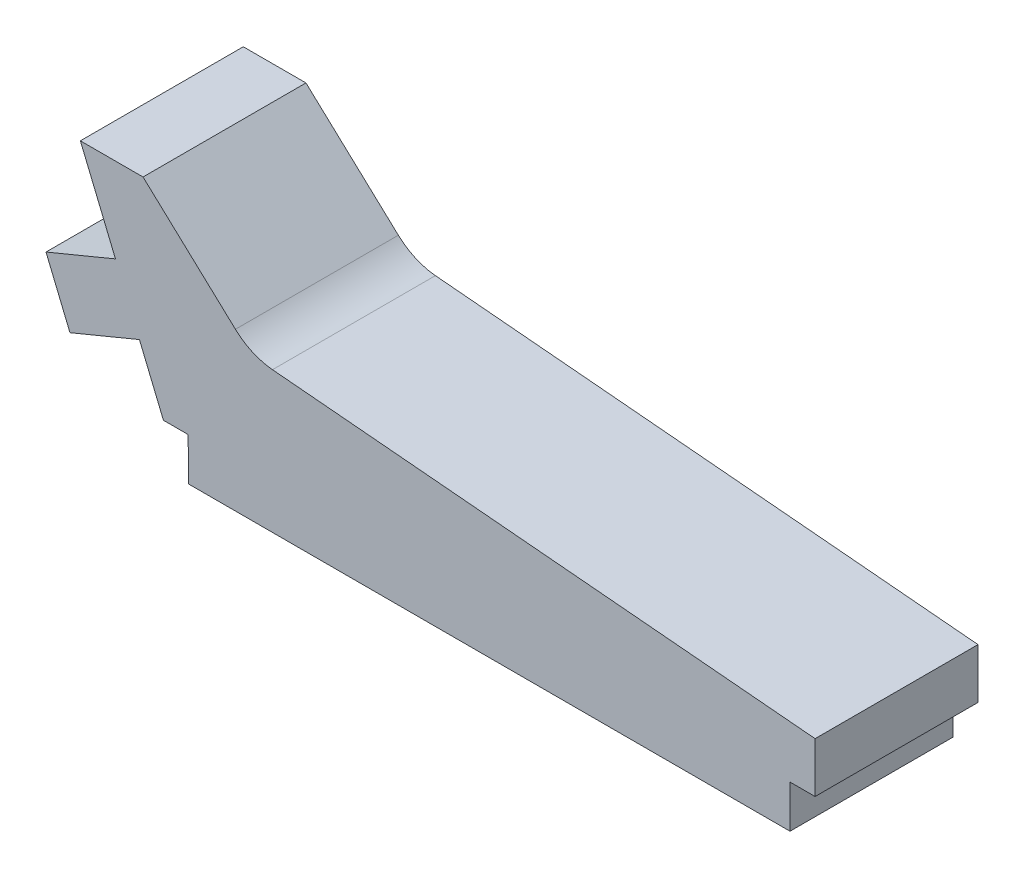
ISO-10303-21;
HEADER;
FILE_DESCRIPTION(('STEP AP214'),'2;1');
FILE_NAME('part.step','',(''),(''),'','','');
FILE_SCHEMA(('AUTOMOTIVE_DESIGN { 1 0 10303 214 1 1 1 1 }'));
ENDSEC;
DATA;
#1=APPLICATION_CONTEXT('core data for automotive mechanical design processes');
#2=APPLICATION_PROTOCOL_DEFINITION('international standard','automotive_design',2000,#1);
#3=PRODUCT_CONTEXT('',#1,'mechanical');
#4=PRODUCT('Part','Part','',(#3));
#5=PRODUCT_RELATED_PRODUCT_CATEGORY('part','',(#4));
#6=PRODUCT_DEFINITION_FORMATION('','',#4);
#7=PRODUCT_DEFINITION_CONTEXT('part definition',#1,'design');
#8=PRODUCT_DEFINITION('design','',#6,#7);
#9=PRODUCT_DEFINITION_SHAPE('','',#8);
#10=(LENGTH_UNIT() NAMED_UNIT(*) SI_UNIT(.MILLI.,.METRE.));
#11=(NAMED_UNIT(*) PLANE_ANGLE_UNIT() SI_UNIT($,.RADIAN.));
#12=(NAMED_UNIT(*) SI_UNIT($,.STERADIAN.) SOLID_ANGLE_UNIT());
#13=UNCERTAINTY_MEASURE_WITH_UNIT(LENGTH_MEASURE(1.E-05),#10,'distance_accuracy_value','');
#14=(GEOMETRIC_REPRESENTATION_CONTEXT(3) GLOBAL_UNCERTAINTY_ASSIGNED_CONTEXT((#13)) GLOBAL_UNIT_ASSIGNED_CONTEXT((#10,
#11,#12)) REPRESENTATION_CONTEXT('',''));
#15=CARTESIAN_POINT('',(0.,0.,0.));
#16=DIRECTION('',(0.,0.,1.));
#17=DIRECTION('',(1.,0.,0.));
#18=AXIS2_PLACEMENT_3D('',#15,#16,#17);
#19=CARTESIAN_POINT('',(103.055278353446,95.0327900963858,67.31));
#20=DIRECTION('',(0.,0.,-1.));
#21=DIRECTION('',(-1.,0.,0.));
#22=AXIS2_PLACEMENT_3D('',#19,#20,#21);
#23=CYLINDRICAL_SURFACE('',#22,6.35);
#24=CARTESIAN_POINT('',(103.055278353446,95.0327900963858,50.8));
#25=DIRECTION('',(0.,0.,1.));
#26=DIRECTION('',(1.,0.,0.));
#27=AXIS2_PLACEMENT_3D('',#24,#25,#26);
#28=CIRCLE('',#27,6.35);
#29=CARTESIAN_POINT('',(98.7376529803762,90.3765457795755,50.8));
#30=VERTEX_POINT('',#29);
#31=CARTESIAN_POINT('',(102.493050685143,88.7077288279872,50.8));
#32=VERTEX_POINT('',#31);
#33=EDGE_CURVE('E145',#30,#32,#28,.T.);
#34=ORIENTED_EDGE('',*,*,#33,.F.);
#35=DIRECTION('',(0.,0.,-1.));
#36=VECTOR('',#35,1.);
#37=CARTESIAN_POINT('',(98.7376529803762,90.3765457795755,67.31));
#38=LINE('',#37,#36);
#39=CARTESIAN_POINT('',(98.7376529803762,90.3765457795755,67.31));
#40=VERTEX_POINT('',#39);
#41=EDGE_CURVE('E11',#40,#30,#38,.T.);
#42=ORIENTED_EDGE('',*,*,#41,.F.);
#43=CARTESIAN_POINT('',(103.055278353446,95.0327900963858,67.31));
#44=DIRECTION('',(0.,0.,1.));
#45=DIRECTION('',(1.,0.,0.));
#46=AXIS2_PLACEMENT_3D('',#43,#44,#45);
#47=CIRCLE('',#46,6.35);
#48=CARTESIAN_POINT('',(102.493050685143,88.7077288279872,67.31));
#49=VERTEX_POINT('',#48);
#50=EDGE_CURVE('E149',#40,#49,#47,.T.);
#51=ORIENTED_EDGE('',*,*,#50,.T.);
#52=DIRECTION('',(0.,0.,-1.));
#53=VECTOR('',#52,1.);
#54=CARTESIAN_POINT('',(102.493050685143,88.7077288279872,67.31));
#55=LINE('',#54,#53);
#56=EDGE_CURVE('E162',#49,#32,#55,.T.);
#57=ORIENTED_EDGE('',*,*,#56,.T.);
#58=EDGE_LOOP('',(#34,#42,#51,#57));
#59=FACE_BOUND('',#58,.T.);
#60=ADVANCED_FACE('F37',(#59),#23,.F.);
#61=CARTESIAN_POINT('',(208.181982596549,-11.1085959651032,67.31));
#62=DIRECTION('',(-0.679941003632963,-0.733266821544927,0.));
#63=DIRECTION('',(0.733266821544927,-0.679941003632963,0.));
#64=AXIS2_PLACEMENT_3D('',#61,#62,#63);
#65=PLANE('',#64);
#66=DIRECTION('',(-0.733266821544927,0.679941003632962,0.));
#67=VECTOR('',#66,1.);
#68=CARTESIAN_POINT('',(208.181982596549,-11.1085959651032,50.8));
#69=LINE('',#68,#67);
#70=CARTESIAN_POINT('',(89.3731804125787,99.06,50.8));
#71=VERTEX_POINT('',#70);
#72=EDGE_CURVE('E210',#30,#71,#69,.T.);
#73=ORIENTED_EDGE('',*,*,#72,.T.);
#74=DIRECTION('',(0.,0.,-1.));
#75=VECTOR('',#74,1.);
#76=CARTESIAN_POINT('',(89.3731804125787,99.06,67.31));
#77=LINE('',#76,#75);
#78=CARTESIAN_POINT('',(89.3731804125787,99.06,67.31));
#79=VERTEX_POINT('',#78);
#80=EDGE_CURVE('E45',#79,#71,#77,.T.);
#81=ORIENTED_EDGE('',*,*,#80,.F.);
#82=DIRECTION('',(-0.733266821544927,0.679941003632962,0.));
#83=VECTOR('',#82,1.);
#84=CARTESIAN_POINT('',(208.181982596549,-11.1085959651032,67.31));
#85=LINE('',#84,#83);
#86=EDGE_CURVE('E209',#40,#79,#85,.T.);
#87=ORIENTED_EDGE('',*,*,#86,.F.);
#88=ORIENTED_EDGE('',*,*,#41,.T.);
#89=EDGE_LOOP('',(#73,#81,#87,#88));
#90=FACE_BOUND('',#89,.T.);
#91=ADVANCED_FACE('F208',(#90),#65,.F.);
#92=CARTESIAN_POINT('',(101.6,99.06,67.31));
#93=DIRECTION('',(0.,-1.,0.));
#94=DIRECTION('',(0.,0.,-1.));
#95=AXIS2_PLACEMENT_3D('',#92,#93,#94);
#96=PLANE('',#95);
#97=DIRECTION('',(-1.,0.,0.));
#98=VECTOR('',#97,1.);
#99=CARTESIAN_POINT('',(101.6,99.06,50.8));
#100=LINE('',#99,#98);
#101=CARTESIAN_POINT('',(83.0231804125787,99.06,50.8));
#102=VERTEX_POINT('',#101);
#103=EDGE_CURVE('E203',#71,#102,#100,.T.);
#104=ORIENTED_EDGE('',*,*,#103,.T.);
#105=DIRECTION('',(0.,0.,-1.));
#106=VECTOR('',#105,1.);
#107=CARTESIAN_POINT('',(83.0231804125787,99.06,67.31));
#108=LINE('',#107,#106);
#109=CARTESIAN_POINT('',(83.0231804125787,99.06,67.31));
#110=VERTEX_POINT('',#109);
#111=EDGE_CURVE('E194',#110,#102,#108,.T.);
#112=ORIENTED_EDGE('',*,*,#111,.F.);
#113=DIRECTION('',(-1.,0.,0.));
#114=VECTOR('',#113,1.);
#115=CARTESIAN_POINT('',(101.6,99.06,67.31));
#116=LINE('',#115,#114);
#117=EDGE_CURVE('E204',#79,#110,#116,.T.);
#118=ORIENTED_EDGE('',*,*,#117,.F.);
#119=ORIENTED_EDGE('',*,*,#80,.T.);
#120=EDGE_LOOP('',(#104,#112,#118,#119));
#121=FACE_BOUND('',#120,.T.);
#122=ADVANCED_FACE('F201',(#121),#96,.F.);
#123=CARTESIAN_POINT('',(165.331918576091,-99.6508719761727,67.31));
#124=DIRECTION('',(0.923879532511291,0.382683432365079,0.));
#125=DIRECTION('',(-0.382683432365079,0.923879532511291,0.));
#126=AXIS2_PLACEMENT_3D('',#123,#124,#125);
#127=PLANE('',#126);
#128=DIRECTION('',(0.382683432365079,-0.923879532511291,0.));
#129=VECTOR('',#128,1.);
#130=CARTESIAN_POINT('',(165.331918576091,-99.6508719761727,50.8));
#131=LINE('',#130,#129);
#132=CARTESIAN_POINT('',(86.5799204089633,90.4732700628934,50.8));
#133=VERTEX_POINT('',#132);
#134=EDGE_CURVE('E212',#102,#133,#131,.T.);
#135=ORIENTED_EDGE('',*,*,#134,.T.);
#136=DIRECTION('',(0.,0.,-1.));
#137=VECTOR('',#136,1.);
#138=CARTESIAN_POINT('',(86.5799204089633,90.4732700628933,67.31));
#139=LINE('',#138,#137);
#140=CARTESIAN_POINT('',(86.5799204089633,90.4732700628933,67.31));
#141=VERTEX_POINT('',#140);
#142=EDGE_CURVE('E191',#141,#133,#139,.T.);
#143=ORIENTED_EDGE('',*,*,#142,.F.);
#144=DIRECTION('',(0.382683432365079,-0.923879532511291,0.));
#145=VECTOR('',#144,1.);
#146=CARTESIAN_POINT('',(165.331918576091,-99.6508719761727,67.31));
#147=LINE('',#146,#145);
#148=EDGE_CURVE('E290',#110,#141,#147,.T.);
#149=ORIENTED_EDGE('',*,*,#148,.F.);
#150=ORIENTED_EDGE('',*,*,#111,.T.);
#151=EDGE_LOOP('',(#135,#143,#149,#150));
#152=FACE_BOUND('',#151,.T.);
#153=ADVANCED_FACE('F288',(#152),#127,.F.);
#154=CARTESIAN_POINT('',(22.8480018328672,64.074645032615,67.31));
#155=DIRECTION('',(0.38268343236511,-0.923879532511278,0.));
#156=DIRECTION('',(0.923879532511279,0.38268343236511,0.));
#157=AXIS2_PLACEMENT_3D('',#154,#155,#156);
#158=PLANE('',#157);
#159=DIRECTION('',(-0.923879532511278,-0.38268343236511,0.));
#160=VECTOR('',#159,1.);
#161=CARTESIAN_POINT('',(22.8480018328672,64.074645032615,50.8));
#162=LINE('',#161,#160);
#163=CARTESIAN_POINT('',(79.5399583712273,87.5572223082712,50.8));
#164=VERTEX_POINT('',#163);
#165=EDGE_CURVE('E219',#133,#164,#162,.T.);
#166=ORIENTED_EDGE('',*,*,#165,.T.);
#167=DIRECTION('',(0.,0.,-1.));
#168=VECTOR('',#167,1.);
#169=CARTESIAN_POINT('',(79.5399583712273,87.5572223082712,67.31));
#170=LINE('',#169,#168);
#171=CARTESIAN_POINT('',(79.5399583712273,87.5572223082712,67.31));
#172=VERTEX_POINT('',#171);
#173=EDGE_CURVE('E188',#172,#164,#170,.T.);
#174=ORIENTED_EDGE('',*,*,#173,.F.);
#175=DIRECTION('',(-0.923879532511278,-0.38268343236511,0.));
#176=VECTOR('',#175,1.);
#177=CARTESIAN_POINT('',(22.8480018328672,64.074645032615,67.31));
#178=LINE('',#177,#176);
#179=EDGE_CURVE('E285',#141,#172,#178,.T.);
#180=ORIENTED_EDGE('',*,*,#179,.F.);
#181=ORIENTED_EDGE('',*,*,#142,.T.);
#182=EDGE_LOOP('',(#166,#174,#180,#181));
#183=FACE_BOUND('',#182,.T.);
#184=ADVANCED_FACE('F284',(#183),#158,.F.);
#185=CARTESIAN_POINT('',(158.291956538356,-102.566919730793,67.31));
#186=DIRECTION('',(0.923879532511287,0.382683432365089,0.));
#187=DIRECTION('',(-0.382683432365089,0.923879532511287,0.));
#188=AXIS2_PLACEMENT_3D('',#185,#186,#187);
#189=PLANE('',#188);
#190=DIRECTION('',(0.382683432365089,-0.923879532511287,0.));
#191=VECTOR('',#190,1.);
#192=CARTESIAN_POINT('',(158.291956538356,-102.566919730793,50.8));
#193=LINE('',#192,#191);
#194=CARTESIAN_POINT('',(81.9699981667456,81.6905872768247,50.8));
#195=VERTEX_POINT('',#194);
#196=EDGE_CURVE('E222',#164,#195,#193,.T.);
#197=ORIENTED_EDGE('',*,*,#196,.T.);
#198=DIRECTION('',(0.,0.,-1.));
#199=VECTOR('',#198,1.);
#200=CARTESIAN_POINT('',(81.9699981667456,81.6905872768247,67.31));
#201=LINE('',#200,#199);
#202=CARTESIAN_POINT('',(81.9699981667456,81.6905872768247,67.31));
#203=VERTEX_POINT('',#202);
#204=EDGE_CURVE('E185',#203,#195,#201,.T.);
#205=ORIENTED_EDGE('',*,*,#204,.F.);
#206=DIRECTION('',(0.382683432365089,-0.923879532511287,0.));
#207=VECTOR('',#206,1.);
#208=CARTESIAN_POINT('',(158.291956538356,-102.566919730793,67.31));
#209=LINE('',#208,#207);
#210=EDGE_CURVE('E281',#172,#203,#209,.T.);
#211=ORIENTED_EDGE('',*,*,#210,.F.);
#212=ORIENTED_EDGE('',*,*,#173,.T.);
#213=EDGE_LOOP('',(#197,#205,#211,#212));
#214=FACE_BOUND('',#213,.T.);
#215=ADVANCED_FACE('F278',(#214),#189,.F.);
#216=CARTESIAN_POINT('',(25.2780416283896,58.2080100011718,67.31));
#217=DIRECTION('',(-0.382683432365087,0.923879532511288,0.));
#218=DIRECTION('',(-0.923879532511288,-0.382683432365087,0.));
#219=AXIS2_PLACEMENT_3D('',#216,#217,#218);
#220=PLANE('',#219);
#221=DIRECTION('',(0.923879532511288,0.382683432365087,0.));
#222=VECTOR('',#221,1.);
#223=CARTESIAN_POINT('',(25.2780416283896,58.2080100011718,50.8));
#224=LINE('',#223,#222);
#225=CARTESIAN_POINT('',(89.0099602044816,84.6066350314467,50.8));
#226=VERTEX_POINT('',#225);
#227=EDGE_CURVE('E225',#195,#226,#224,.T.);
#228=ORIENTED_EDGE('',*,*,#227,.T.);
#229=DIRECTION('',(0.,0.,-1.));
#230=VECTOR('',#229,1.);
#231=CARTESIAN_POINT('',(89.0099602044816,84.6066350314467,67.31));
#232=LINE('',#231,#230);
#233=CARTESIAN_POINT('',(89.0099602044816,84.6066350314467,67.31));
#234=VERTEX_POINT('',#233);
#235=EDGE_CURVE('E182',#234,#226,#232,.T.);
#236=ORIENTED_EDGE('',*,*,#235,.F.);
#237=DIRECTION('',(0.923879532511288,0.382683432365087,0.));
#238=VECTOR('',#237,1.);
#239=CARTESIAN_POINT('',(25.2780416283896,58.2080100011718,67.31));
#240=LINE('',#239,#238);
#241=EDGE_CURVE('E275',#203,#234,#240,.T.);
#242=ORIENTED_EDGE('',*,*,#241,.F.);
#243=ORIENTED_EDGE('',*,*,#204,.T.);
#244=EDGE_LOOP('',(#228,#236,#242,#243));
#245=FACE_BOUND('',#244,.T.);
#246=ADVANCED_FACE('F274',(#245),#220,.F.);
#247=CARTESIAN_POINT('',(165.331918576093,-99.6508719761702,67.31));
#248=DIRECTION('',(0.923879532511284,0.382683432365095,0.));
#249=DIRECTION('',(-0.382683432365095,0.923879532511284,0.));
#250=AXIS2_PLACEMENT_3D('',#247,#248,#249);
#251=PLANE('',#250);
#252=DIRECTION('',(0.382683432365095,-0.923879532511285,0.));
#253=VECTOR('',#252,1.);
#254=CARTESIAN_POINT('',(165.331918576093,-99.6508719761702,50.8));
#255=LINE('',#254,#253);
#256=CARTESIAN_POINT('',(91.44,78.74,50.8));
#257=VERTEX_POINT('',#256);
#258=EDGE_CURVE('E228',#226,#257,#255,.T.);
#259=ORIENTED_EDGE('',*,*,#258,.T.);
#260=DIRECTION('',(0.,0.,-1.));
#261=VECTOR('',#260,1.);
#262=CARTESIAN_POINT('',(91.44,78.74,67.31));
#263=LINE('',#262,#261);
#264=CARTESIAN_POINT('',(91.44,78.74,67.31));
#265=VERTEX_POINT('',#264);
#266=EDGE_CURVE('E179',#265,#257,#263,.T.);
#267=ORIENTED_EDGE('',*,*,#266,.F.);
#268=DIRECTION('',(0.382683432365095,-0.923879532511285,0.));
#269=VECTOR('',#268,1.);
#270=CARTESIAN_POINT('',(165.331918576093,-99.6508719761702,67.31));
#271=LINE('',#270,#269);
#272=EDGE_CURVE('E271',#234,#265,#271,.T.);
#273=ORIENTED_EDGE('',*,*,#272,.F.);
#274=ORIENTED_EDGE('',*,*,#235,.T.);
#275=EDGE_LOOP('',(#259,#267,#273,#274));
#276=FACE_BOUND('',#275,.T.);
#277=ADVANCED_FACE('F268',(#276),#251,.F.);
#278=CARTESIAN_POINT('',(101.6,78.74,67.31));
#279=DIRECTION('',(0.,1.,0.));
#280=DIRECTION('',(0.,0.,1.));
#281=AXIS2_PLACEMENT_3D('',#278,#279,#280);
#282=PLANE('',#281);
#283=DIRECTION('',(1.,0.,0.));
#284=VECTOR('',#283,1.);
#285=CARTESIAN_POINT('',(101.6,78.74,50.8));
#286=LINE('',#285,#284);
#287=CARTESIAN_POINT('',(93.9474229626747,78.74,50.8));
#288=VERTEX_POINT('',#287);
#289=EDGE_CURVE('E231',#257,#288,#286,.T.);
#290=ORIENTED_EDGE('',*,*,#289,.T.);
#291=DIRECTION('',(0.,0.,-1.));
#292=VECTOR('',#291,1.);
#293=CARTESIAN_POINT('',(93.9474229626747,78.74,67.31));
#294=LINE('',#293,#292);
#295=CARTESIAN_POINT('',(93.9474229626747,78.74,67.31));
#296=VERTEX_POINT('',#295);
#297=EDGE_CURVE('E176',#296,#288,#294,.T.);
#298=ORIENTED_EDGE('',*,*,#297,.F.);
#299=DIRECTION('',(1.,0.,0.));
#300=VECTOR('',#299,1.);
#301=CARTESIAN_POINT('',(101.6,78.74,67.31));
#302=LINE('',#301,#300);
#303=EDGE_CURVE('E265',#265,#296,#302,.T.);
#304=ORIENTED_EDGE('',*,*,#303,.F.);
#305=ORIENTED_EDGE('',*,*,#266,.T.);
#306=EDGE_LOOP('',(#290,#298,#304,#305));
#307=FACE_BOUND('',#306,.T.);
#308=ADVANCED_FACE('F264',(#307),#282,.F.);
#309=CARTESIAN_POINT('',(95.492799547849,-126.095572619481,67.31));
#310=DIRECTION('',(0.99997154167335,0.00754425897113801,0.));
#311=DIRECTION('',(-0.00754425897113801,0.99997154167335,0.));
#312=AXIS2_PLACEMENT_3D('',#309,#310,#311);
#313=PLANE('',#312);
#314=DIRECTION('',(0.00754425897113801,-0.99997154167335,0.));
#315=VECTOR('',#314,1.);
#316=CARTESIAN_POINT('',(95.492799547849,-126.095572619481,50.8));
#317=LINE('',#316,#315);
#318=CARTESIAN_POINT('',(93.98,74.422,50.8));
#319=VERTEX_POINT('',#318);
#320=EDGE_CURVE('E234',#288,#319,#317,.T.);
#321=ORIENTED_EDGE('',*,*,#320,.T.);
#322=DIRECTION('',(0.,0.,-1.));
#323=VECTOR('',#322,1.);
#324=CARTESIAN_POINT('',(93.98,74.422,67.31));
#325=LINE('',#324,#323);
#326=CARTESIAN_POINT('',(93.98,74.422,67.31));
#327=VERTEX_POINT('',#326);
#328=EDGE_CURVE('E173',#327,#319,#325,.T.);
#329=ORIENTED_EDGE('',*,*,#328,.F.);
#330=DIRECTION('',(0.00754425897113801,-0.99997154167335,0.));
#331=VECTOR('',#330,1.);
#332=CARTESIAN_POINT('',(95.492799547849,-126.095572619481,67.31));
#333=LINE('',#332,#331);
#334=EDGE_CURVE('E261',#296,#327,#333,.T.);
#335=ORIENTED_EDGE('',*,*,#334,.F.);
#336=ORIENTED_EDGE('',*,*,#297,.T.);
#337=EDGE_LOOP('',(#321,#329,#335,#336));
#338=FACE_BOUND('',#337,.T.);
#339=ADVANCED_FACE('F258',(#338),#313,.F.);
#340=CARTESIAN_POINT('',(101.6,74.422,67.31));
#341=DIRECTION('',(0.,1.,0.));
#342=DIRECTION('',(0.,0.,1.));
#343=AXIS2_PLACEMENT_3D('',#340,#341,#342);
#344=PLANE('',#343);
#345=DIRECTION('',(1.,0.,0.));
#346=VECTOR('',#345,1.);
#347=CARTESIAN_POINT('',(101.6,74.422,50.8));
#348=LINE('',#347,#346);
#349=CARTESIAN_POINT('',(154.94,74.422,50.8));
#350=VERTEX_POINT('',#349);
#351=EDGE_CURVE('E237',#319,#350,#348,.T.);
#352=ORIENTED_EDGE('',*,*,#351,.T.);
#353=DIRECTION('',(0.,0.,-1.));
#354=VECTOR('',#353,1.);
#355=CARTESIAN_POINT('',(154.94,74.422,67.31));
#356=LINE('',#355,#354);
#357=CARTESIAN_POINT('',(154.94,74.422,67.31));
#358=VERTEX_POINT('',#357);
#359=EDGE_CURVE('E170',#358,#350,#356,.T.);
#360=ORIENTED_EDGE('',*,*,#359,.F.);
#361=DIRECTION('',(1.,0.,0.));
#362=VECTOR('',#361,1.);
#363=CARTESIAN_POINT('',(101.6,74.422,67.31));
#364=LINE('',#363,#362);
#365=EDGE_CURVE('E255',#327,#358,#364,.T.);
#366=ORIENTED_EDGE('',*,*,#365,.F.);
#367=ORIENTED_EDGE('',*,*,#328,.T.);
#368=EDGE_LOOP('',(#352,#360,#366,#367));
#369=FACE_BOUND('',#368,.T.);
#370=ADVANCED_FACE('F254',(#369),#344,.F.);
#371=CARTESIAN_POINT('',(154.94,-126.049497006446,67.31));
#372=DIRECTION('',(-1.,0.,0.));
#373=DIRECTION('',(0.,0.,1.));
#374=AXIS2_PLACEMENT_3D('',#371,#372,#373);
#375=PLANE('',#374);
#376=DIRECTION('',(0.,1.,0.));
#377=VECTOR('',#376,1.);
#378=CARTESIAN_POINT('',(154.94,-126.049497006446,50.8));
#379=LINE('',#378,#377);
#380=CARTESIAN_POINT('',(154.94,78.74,50.8));
#381=VERTEX_POINT('',#380);
#382=EDGE_CURVE('E240',#350,#381,#379,.T.);
#383=ORIENTED_EDGE('',*,*,#382,.T.);
#384=DIRECTION('',(0.,0.,-1.));
#385=VECTOR('',#384,1.);
#386=CARTESIAN_POINT('',(154.94,78.74,67.31));
#387=LINE('',#386,#385);
#388=CARTESIAN_POINT('',(154.94,78.74,67.31));
#389=VERTEX_POINT('',#388);
#390=EDGE_CURVE('E164',#389,#381,#387,.T.);
#391=ORIENTED_EDGE('',*,*,#390,.F.);
#392=DIRECTION('',(0.,1.,0.));
#393=VECTOR('',#392,1.);
#394=CARTESIAN_POINT('',(154.94,-126.049497006446,67.31));
#395=LINE('',#394,#393);
#396=EDGE_CURVE('E251',#358,#389,#395,.T.);
#397=ORIENTED_EDGE('',*,*,#396,.F.);
#398=ORIENTED_EDGE('',*,*,#359,.T.);
#399=EDGE_LOOP('',(#383,#391,#397,#398));
#400=FACE_BOUND('',#399,.T.);
#401=ADVANCED_FACE('F248',(#400),#375,.F.);
#402=CARTESIAN_POINT('',(101.599999999999,78.7399999999997,67.31));
#403=DIRECTION('',(0.,1.,0.));
#404=DIRECTION('',(-1.,0.,0.));
#405=AXIS2_PLACEMENT_3D('',#402,#403,#404);
#406=PLANE('',#405);
#407=DIRECTION('',(1.,0.,0.));
#408=VECTOR('',#407,1.);
#409=CARTESIAN_POINT('',(101.599999999999,78.7399999999997,50.8));
#410=LINE('',#409,#408);
#411=CARTESIAN_POINT('',(157.48,78.74,50.8));
#412=VERTEX_POINT('',#411);
#413=EDGE_CURVE('E159',#381,#412,#410,.T.);
#414=ORIENTED_EDGE('',*,*,#413,.T.);
#415=DIRECTION('',(0.,0.,-1.));
#416=VECTOR('',#415,1.);
#417=CARTESIAN_POINT('',(157.48,78.74,67.31));
#418=LINE('',#417,#416);
#419=CARTESIAN_POINT('',(157.48,78.74,67.31));
#420=VERTEX_POINT('',#419);
#421=EDGE_CURVE('E158',#420,#412,#418,.T.);
#422=ORIENTED_EDGE('',*,*,#421,.F.);
#423=DIRECTION('',(1.,0.,0.));
#424=VECTOR('',#423,1.);
#425=CARTESIAN_POINT('',(101.599999999999,78.7399999999997,67.31));
#426=LINE('',#425,#424);
#427=EDGE_CURVE('E303',#389,#420,#426,.T.);
#428=ORIENTED_EDGE('',*,*,#427,.F.);
#429=ORIENTED_EDGE('',*,*,#390,.T.);
#430=EDGE_LOOP('',(#414,#422,#428,#429));
#431=FACE_BOUND('',#430,.T.);
#432=ADVANCED_FACE('F244',(#431),#406,.F.);
#433=CARTESIAN_POINT('',(157.48,-126.049497006446,67.31));
#434=DIRECTION('',(-1.,0.,0.));
#435=DIRECTION('',(0.,0.,1.));
#436=AXIS2_PLACEMENT_3D('',#433,#434,#435);
#437=PLANE('',#436);
#438=DIRECTION('',(0.,1.,0.));
#439=VECTOR('',#438,1.);
#440=CARTESIAN_POINT('',(157.48,-126.049497006446,50.8));
#441=LINE('',#440,#439);
#442=CARTESIAN_POINT('',(157.48,83.82,50.8));
#443=VERTEX_POINT('',#442);
#444=EDGE_CURVE('E142',#412,#443,#441,.T.);
#445=ORIENTED_EDGE('',*,*,#444,.T.);
#446=DIRECTION('',(0.,0.,-1.));
#447=VECTOR('',#446,1.);
#448=CARTESIAN_POINT('',(157.48,83.82,67.31));
#449=LINE('',#448,#447);
#450=CARTESIAN_POINT('',(157.48,83.82,67.31));
#451=VERTEX_POINT('',#450);
#452=EDGE_CURVE('E156',#451,#443,#449,.T.);
#453=ORIENTED_EDGE('',*,*,#452,.F.);
#454=DIRECTION('',(0.,1.,0.));
#455=VECTOR('',#454,1.);
#456=CARTESIAN_POINT('',(157.48,-126.049497006446,67.31));
#457=LINE('',#456,#455);
#458=EDGE_CURVE('E305',#420,#451,#457,.T.);
#459=ORIENTED_EDGE('',*,*,#458,.F.);
#460=ORIENTED_EDGE('',*,*,#421,.T.);
#461=EDGE_LOOP('',(#445,#453,#459,#460));
#462=FACE_BOUND('',#461,.T.);
#463=ADVANCED_FACE('F154',(#462),#437,.F.);
#464=CARTESIAN_POINT('',(120.546883616443,87.1029436785384,67.31));
#465=DIRECTION('',(-0.0885397902837935,-0.996072640692687,0.));
#466=DIRECTION('',(0.996072640692687,-0.0885397902837935,0.));
#467=AXIS2_PLACEMENT_3D('',#464,#465,#466);
#468=PLANE('',#467);
#469=DIRECTION('',(-0.996072640692687,0.0885397902837935,0.));
#470=VECTOR('',#469,1.);
#471=CARTESIAN_POINT('',(120.546883616443,87.1029436785384,50.8));
#472=LINE('',#471,#470);
#473=EDGE_CURVE('E139',#443,#32,#472,.T.);
#474=ORIENTED_EDGE('',*,*,#473,.T.);
#475=ORIENTED_EDGE('',*,*,#56,.F.);
#476=DIRECTION('',(-0.996072640692687,0.0885397902837935,0.));
#477=VECTOR('',#476,1.);
#478=CARTESIAN_POINT('',(120.546883616443,87.1029436785384,67.31));
#479=LINE('',#478,#477);
#480=EDGE_CURVE('E52',#451,#49,#479,.T.);
#481=ORIENTED_EDGE('',*,*,#480,.F.);
#482=ORIENTED_EDGE('',*,*,#452,.T.);
#483=EDGE_LOOP('',(#474,#475,#481,#482));
#484=FACE_BOUND('',#483,.T.);
#485=ADVANCED_FACE('F161',(#484),#468,.F.);
#486=CARTESIAN_POINT('',(101.6,-126.049497006446,67.31));
#487=DIRECTION('',(0.,0.,1.));
#488=DIRECTION('',(1.,0.,0.));
#489=AXIS2_PLACEMENT_3D('',#486,#487,#488);
#490=PLANE('',#489);
#491=ORIENTED_EDGE('',*,*,#50,.F.);
#492=ORIENTED_EDGE('',*,*,#86,.T.);
#493=ORIENTED_EDGE('',*,*,#117,.T.);
#494=ORIENTED_EDGE('',*,*,#148,.T.);
#495=ORIENTED_EDGE('',*,*,#179,.T.);
#496=ORIENTED_EDGE('',*,*,#210,.T.);
#497=ORIENTED_EDGE('',*,*,#241,.T.);
#498=ORIENTED_EDGE('',*,*,#272,.T.);
#499=ORIENTED_EDGE('',*,*,#303,.T.);
#500=ORIENTED_EDGE('',*,*,#334,.T.);
#501=ORIENTED_EDGE('',*,*,#365,.T.);
#502=ORIENTED_EDGE('',*,*,#396,.T.);
#503=ORIENTED_EDGE('',*,*,#427,.T.);
#504=ORIENTED_EDGE('',*,*,#458,.T.);
#505=ORIENTED_EDGE('',*,*,#480,.T.);
#506=EDGE_LOOP('',(#491,#492,#493,#494,#495,#496,#497,#498,#499,#500,#501,#502,#503,#504,#505));
#507=FACE_BOUND('',#506,.T.);
#508=ADVANCED_FACE('F306',(#507),#490,.T.);
#509=CARTESIAN_POINT('',(0.,-12598.4,50.8));
#510=DIRECTION('',(0.,0.,1.));
#511=DIRECTION('',(1.,0.,0.));
#512=AXIS2_PLACEMENT_3D('',#509,#510,#511);
#513=PLANE('',#512);
#514=ORIENTED_EDGE('',*,*,#33,.T.);
#515=ORIENTED_EDGE('',*,*,#473,.F.);
#516=ORIENTED_EDGE('',*,*,#444,.F.);
#517=ORIENTED_EDGE('',*,*,#413,.F.);
#518=ORIENTED_EDGE('',*,*,#382,.F.);
#519=ORIENTED_EDGE('',*,*,#351,.F.);
#520=ORIENTED_EDGE('',*,*,#320,.F.);
#521=ORIENTED_EDGE('',*,*,#289,.F.);
#522=ORIENTED_EDGE('',*,*,#258,.F.);
#523=ORIENTED_EDGE('',*,*,#227,.F.);
#524=ORIENTED_EDGE('',*,*,#196,.F.);
#525=ORIENTED_EDGE('',*,*,#165,.F.);
#526=ORIENTED_EDGE('',*,*,#134,.F.);
#527=ORIENTED_EDGE('',*,*,#103,.F.);
#528=ORIENTED_EDGE('',*,*,#72,.F.);
#529=EDGE_LOOP('',(#514,#515,#516,#517,#518,#519,#520,#521,#522,#523,#524,#525,#526,#527,#528));
#530=FACE_BOUND('',#529,.T.);
#531=ADVANCED_FACE('F141',(#530),#513,.F.);
#532=CLOSED_SHELL('',(#60,#91,#122,#153,#184,#215,#246,#277,#308,#339,#370,#401,#432,#463,#485,
#508,#531));
#533=MANIFOLD_SOLID_BREP('B2',#532);
#534=ADVANCED_BREP_SHAPE_REPRESENTATION('',(#18,#533),#14);
#535=SHAPE_DEFINITION_REPRESENTATION(#9,#534);
ENDSEC;
END-ISO-10303-21;
